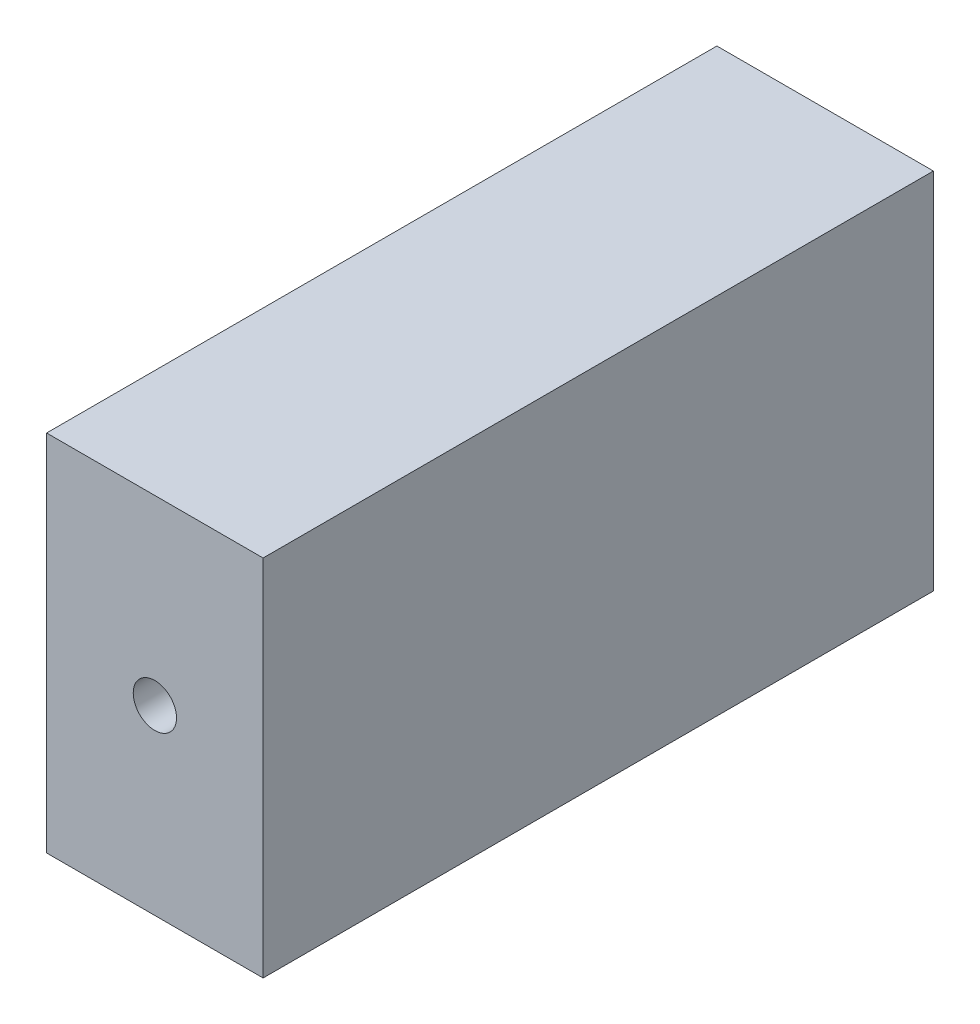
ISO-10303-21;
HEADER;
FILE_DESCRIPTION(('STEP AP214'),'2;1');
FILE_NAME('part.step','',(''),(''),'','','');
FILE_SCHEMA(('AUTOMOTIVE_DESIGN { 1 0 10303 214 1 1 1 1 }'));
ENDSEC;
DATA;
#1=APPLICATION_CONTEXT('core data for automotive mechanical design processes');
#2=APPLICATION_PROTOCOL_DEFINITION('international standard','automotive_design',2000,#1);
#3=PRODUCT_CONTEXT('',#1,'mechanical');
#4=PRODUCT('Part','Part','',(#3));
#5=PRODUCT_RELATED_PRODUCT_CATEGORY('part','',(#4));
#6=PRODUCT_DEFINITION_FORMATION('','',#4);
#7=PRODUCT_DEFINITION_CONTEXT('part definition',#1,'design');
#8=PRODUCT_DEFINITION('design','',#6,#7);
#9=PRODUCT_DEFINITION_SHAPE('','',#8);
#10=(LENGTH_UNIT() NAMED_UNIT(*) SI_UNIT(.MILLI.,.METRE.));
#11=(NAMED_UNIT(*) PLANE_ANGLE_UNIT() SI_UNIT($,.RADIAN.));
#12=(NAMED_UNIT(*) SI_UNIT($,.STERADIAN.) SOLID_ANGLE_UNIT());
#13=UNCERTAINTY_MEASURE_WITH_UNIT(LENGTH_MEASURE(1.E-05),#10,'distance_accuracy_value','');
#14=(GEOMETRIC_REPRESENTATION_CONTEXT(3) GLOBAL_UNCERTAINTY_ASSIGNED_CONTEXT((#13)) GLOBAL_UNIT_ASSIGNED_CONTEXT((#10,
#11,#12)) REPRESENTATION_CONTEXT('',''));
#15=CARTESIAN_POINT('',(0.,0.,0.));
#16=DIRECTION('',(0.,0.,1.));
#17=DIRECTION('',(1.,0.,0.));
#18=AXIS2_PLACEMENT_3D('',#15,#16,#17);
#19=CARTESIAN_POINT('',(25.4,42.674371654535,-78.6359208016151));
#20=DIRECTION('',(0.,0.,1.));
#21=DIRECTION('',(1.,0.,0.));
#22=AXIS2_PLACEMENT_3D('',#19,#20,#21);
#23=PLANE('',#22);
#24=CARTESIAN_POINT('',(0.,0.,-78.6359208016151));
#25=DIRECTION('',(0.,0.,1.));
#26=DIRECTION('',(1.,0.,0.));
#27=AXIS2_PLACEMENT_3D('',#24,#25,#26);
#28=CIRCLE('',#27,5.08);
#29=CARTESIAN_POINT('',(5.08,0.,-78.6359208016151));
#30=VERTEX_POINT('',#29);
#31=EDGE_CURVE('E46',#30,#30,#28,.F.);
#32=ORIENTED_EDGE('',*,*,#31,.F.);
#33=EDGE_LOOP('',(#32));
#34=FACE_BOUND('',#33,.T.);
#35=DIRECTION('',(0.,1.,0.));
#36=VECTOR('',#35,1.);
#37=CARTESIAN_POINT('',(-25.4,42.674371654535,-78.6359208016151));
#38=LINE('',#37,#36);
#39=CARTESIAN_POINT('',(-25.4,-42.674371654535,-78.6359208016151));
#40=VERTEX_POINT('',#39);
#41=CARTESIAN_POINT('',(-25.4,42.674371654535,-78.6359208016151));
#42=VERTEX_POINT('',#41);
#43=EDGE_CURVE('E109',#40,#42,#38,.T.);
#44=ORIENTED_EDGE('',*,*,#43,.T.);
#45=DIRECTION('',(-1.,0.,0.));
#46=VECTOR('',#45,1.);
#47=CARTESIAN_POINT('',(25.4,42.674371654535,-78.6359208016151));
#48=LINE('',#47,#46);
#49=CARTESIAN_POINT('',(25.4,42.674371654535,-78.6359208016151));
#50=VERTEX_POINT('',#49);
#51=EDGE_CURVE('E12',#50,#42,#48,.T.);
#52=ORIENTED_EDGE('',*,*,#51,.F.);
#53=DIRECTION('',(0.,1.,0.));
#54=VECTOR('',#53,1.);
#55=CARTESIAN_POINT('',(25.4,42.674371654535,-78.6359208016151));
#56=LINE('',#55,#54);
#57=CARTESIAN_POINT('',(25.4,-42.674371654535,-78.6359208016151));
#58=VERTEX_POINT('',#57);
#59=EDGE_CURVE('E96',#58,#50,#56,.T.);
#60=ORIENTED_EDGE('',*,*,#59,.F.);
#61=DIRECTION('',(-1.,0.,0.));
#62=VECTOR('',#61,1.);
#63=CARTESIAN_POINT('',(25.4,-42.674371654535,-78.6359208016151));
#64=LINE('',#63,#62);
#65=EDGE_CURVE('E105',#58,#40,#64,.T.);
#66=ORIENTED_EDGE('',*,*,#65,.T.);
#67=EDGE_LOOP('',(#44,#52,#60,#66));
#68=FACE_BOUND('',#67,.T.);
#69=ADVANCED_FACE('F43',(#34,#68),#23,.F.);
#70=CARTESIAN_POINT('',(25.4,42.674371654535,78.6359208016151));
#71=DIRECTION('',(0.,-1.,0.));
#72=DIRECTION('',(0.,0.,-1.));
#73=AXIS2_PLACEMENT_3D('',#70,#71,#72);
#74=PLANE('',#73);
#75=DIRECTION('',(0.,0.,1.));
#76=VECTOR('',#75,1.);
#77=CARTESIAN_POINT('',(-25.4,42.674371654535,78.6359208016151));
#78=LINE('',#77,#76);
#79=CARTESIAN_POINT('',(-25.4,42.674371654535,78.6359208016151));
#80=VERTEX_POINT('',#79);
#81=EDGE_CURVE('E100',#42,#80,#78,.T.);
#82=ORIENTED_EDGE('',*,*,#81,.T.);
#83=DIRECTION('',(-1.,0.,0.));
#84=VECTOR('',#83,1.);
#85=CARTESIAN_POINT('',(25.4,42.674371654535,78.6359208016151));
#86=LINE('',#85,#84);
#87=CARTESIAN_POINT('',(25.4,42.674371654535,78.6359208016151));
#88=VERTEX_POINT('',#87);
#89=EDGE_CURVE('E52',#88,#80,#86,.T.);
#90=ORIENTED_EDGE('',*,*,#89,.F.);
#91=DIRECTION('',(0.,0.,1.));
#92=VECTOR('',#91,1.);
#93=CARTESIAN_POINT('',(25.4,42.674371654535,78.6359208016151));
#94=LINE('',#93,#92);
#95=EDGE_CURVE('E91',#50,#88,#94,.T.);
#96=ORIENTED_EDGE('',*,*,#95,.F.);
#97=ORIENTED_EDGE('',*,*,#51,.T.);
#98=EDGE_LOOP('',(#82,#90,#96,#97));
#99=FACE_BOUND('',#98,.T.);
#100=ADVANCED_FACE('F99',(#99),#74,.F.);
#101=CARTESIAN_POINT('',(25.4,42.674371654535,78.6359208016151));
#102=DIRECTION('',(0.,0.,-1.));
#103=DIRECTION('',(-1.,0.,0.));
#104=AXIS2_PLACEMENT_3D('',#101,#102,#103);
#105=PLANE('',#104);
#106=CARTESIAN_POINT('',(0.,0.,78.6359208016151));
#107=DIRECTION('',(0.,0.,-1.));
#108=DIRECTION('',(-1.,0.,0.));
#109=AXIS2_PLACEMENT_3D('',#106,#107,#108);
#110=CIRCLE('',#109,5.08);
#111=CARTESIAN_POINT('',(-5.08,0.,78.6359208016151));
#112=VERTEX_POINT('',#111);
#113=EDGE_CURVE('E116',#112,#112,#110,.F.);
#114=ORIENTED_EDGE('',*,*,#113,.F.);
#115=EDGE_LOOP('',(#114));
#116=FACE_BOUND('',#115,.T.);
#117=DIRECTION('',(0.,-1.,0.));
#118=VECTOR('',#117,1.);
#119=CARTESIAN_POINT('',(-25.4,42.674371654535,78.6359208016151));
#120=LINE('',#119,#118);
#121=CARTESIAN_POINT('',(-25.4,-42.674371654535,78.6359208016151));
#122=VERTEX_POINT('',#121);
#123=EDGE_CURVE('E78',#80,#122,#120,.T.);
#124=ORIENTED_EDGE('',*,*,#123,.T.);
#125=DIRECTION('',(-1.,0.,0.));
#126=VECTOR('',#125,1.);
#127=CARTESIAN_POINT('',(25.4,-42.674371654535,78.6359208016151));
#128=LINE('',#127,#126);
#129=CARTESIAN_POINT('',(25.4,-42.674371654535,78.6359208016151));
#130=VERTEX_POINT('',#129);
#131=EDGE_CURVE('E101',#130,#122,#128,.T.);
#132=ORIENTED_EDGE('',*,*,#131,.F.);
#133=DIRECTION('',(0.,-1.,0.));
#134=VECTOR('',#133,1.);
#135=CARTESIAN_POINT('',(25.4,42.674371654535,78.6359208016151));
#136=LINE('',#135,#134);
#137=EDGE_CURVE('E94',#88,#130,#136,.T.);
#138=ORIENTED_EDGE('',*,*,#137,.F.);
#139=ORIENTED_EDGE('',*,*,#89,.T.);
#140=EDGE_LOOP('',(#124,#132,#138,#139));
#141=FACE_BOUND('',#140,.T.);
#142=ADVANCED_FACE('F103',(#116,#141),#105,.F.);
#143=CARTESIAN_POINT('',(25.4,-42.674371654535,78.6359208016151));
#144=DIRECTION('',(0.,1.,0.));
#145=DIRECTION('',(0.,0.,1.));
#146=AXIS2_PLACEMENT_3D('',#143,#144,#145);
#147=PLANE('',#146);
#148=DIRECTION('',(0.,0.,-1.));
#149=VECTOR('',#148,1.);
#150=CARTESIAN_POINT('',(-25.4,-42.674371654535,78.6359208016151));
#151=LINE('',#150,#149);
#152=EDGE_CURVE('E84',#122,#40,#151,.T.);
#153=ORIENTED_EDGE('',*,*,#152,.T.);
#154=ORIENTED_EDGE('',*,*,#65,.F.);
#155=DIRECTION('',(0.,0.,-1.));
#156=VECTOR('',#155,1.);
#157=CARTESIAN_POINT('',(25.4,-42.674371654535,78.6359208016151));
#158=LINE('',#157,#156);
#159=EDGE_CURVE('E61',#130,#58,#158,.T.);
#160=ORIENTED_EDGE('',*,*,#159,.F.);
#161=ORIENTED_EDGE('',*,*,#131,.T.);
#162=EDGE_LOOP('',(#153,#154,#160,#161));
#163=FACE_BOUND('',#162,.T.);
#164=ADVANCED_FACE('F156',(#163),#147,.F.);
#165=CARTESIAN_POINT('',(25.4,0.,0.));
#166=DIRECTION('',(1.,0.,0.));
#167=DIRECTION('',(0.,0.,-1.));
#168=AXIS2_PLACEMENT_3D('',#165,#166,#167);
#169=PLANE('',#168);
#170=ORIENTED_EDGE('',*,*,#59,.T.);
#171=ORIENTED_EDGE('',*,*,#95,.T.);
#172=ORIENTED_EDGE('',*,*,#137,.T.);
#173=ORIENTED_EDGE('',*,*,#159,.T.);
#174=EDGE_LOOP('',(#170,#171,#172,#173));
#175=FACE_BOUND('',#174,.T.);
#176=ADVANCED_FACE('F92',(#175),#169,.T.);
#177=CARTESIAN_POINT('',(-25.4,0.,0.));
#178=DIRECTION('',(1.,0.,0.));
#179=DIRECTION('',(0.,0.,-1.));
#180=AXIS2_PLACEMENT_3D('',#177,#178,#179);
#181=PLANE('',#180);
#182=ORIENTED_EDGE('',*,*,#43,.F.);
#183=ORIENTED_EDGE('',*,*,#152,.F.);
#184=ORIENTED_EDGE('',*,*,#123,.F.);
#185=ORIENTED_EDGE('',*,*,#81,.F.);
#186=EDGE_LOOP('',(#182,#183,#184,#185));
#187=FACE_BOUND('',#186,.T.);
#188=ADVANCED_FACE('F143',(#187),#181,.F.);
#189=CARTESIAN_POINT('',(0.,0.,-40.3122007325297));
#190=DIRECTION('',(0.,0.,-1.));
#191=DIRECTION('',(-1.,0.,0.));
#192=AXIS2_PLACEMENT_3D('',#189,#190,#191);
#193=CYLINDRICAL_SURFACE('',#192,5.08);
#194=CARTESIAN_POINT('',(0.,0.,-46.2429474483486));
#195=DIRECTION('',(0.,-0.462552923998327,-0.88659167179745));
#196=DIRECTION('',(0.,-0.88659167179745,0.462552923998327));
#197=AXIS2_PLACEMENT_3D('',#194,#195,#196);
#198=ELLIPSE('',#197,5.72980793931997,5.08);
#199=CARTESIAN_POINT('',(0.,-5.07999999999999,-43.5926080320673));
#200=VERTEX_POINT('',#199);
#201=EDGE_CURVE('E133',#200,#200,#198,.T.);
#202=ORIENTED_EDGE('',*,*,#201,.F.);
#203=EDGE_LOOP('',(#202));
#204=FACE_BOUND('',#203,.T.);
#205=ORIENTED_EDGE('',*,*,#31,.T.);
#206=EDGE_LOOP('',(#205));
#207=FACE_BOUND('',#206,.T.);
#208=ADVANCED_FACE('F139',(#204,#207),#193,.F.);
#209=CARTESIAN_POINT('',(0.,0.,86.8859445844237));
#210=DIRECTION('',(0.,0.,-1.));
#211=DIRECTION('',(-1.,0.,0.));
#212=AXIS2_PLACEMENT_3D('',#209,#210,#211);
#213=CYLINDRICAL_SURFACE('',#212,5.08);
#214=CARTESIAN_POINT('',(0.,0.,36.0138675869734));
#215=DIRECTION('',(0.,0.546184510297637,-0.837664897623704));
#216=DIRECTION('',(0.,-0.837664897623704,-0.546184510297637));
#217=AXIS2_PLACEMENT_3D('',#214,#215,#216);
#218=ELLIPSE('',#217,6.06447759051501,5.08);
#219=CARTESIAN_POINT('',(0.,-5.08,32.701543863987));
#220=VERTEX_POINT('',#219);
#221=EDGE_CURVE('E118',#220,#220,#218,.T.);
#222=ORIENTED_EDGE('',*,*,#221,.T.);
#223=EDGE_LOOP('',(#222));
#224=FACE_BOUND('',#223,.T.);
#225=ORIENTED_EDGE('',*,*,#113,.T.);
#226=EDGE_LOOP('',(#225));
#227=FACE_BOUND('',#226,.T.);
#228=ADVANCED_FACE('F142',(#224,#227),#213,.F.);
#229=CARTESIAN_POINT('',(0.,33.2372159452722,-23.0597354616095));
#230=DIRECTION('',(0.,-0.820191140364952,-0.572089585001195));
#231=DIRECTION('',(0.,0.572089585001195,-0.820191140364952));
#232=AXIS2_PLACEMENT_3D('',#229,#230,#231);
#233=CYLINDRICAL_SURFACE('',#232,5.08);
#234=CARTESIAN_POINT('',(0.,28.3728700332091,-26.4526538890095));
#235=DIRECTION('',(0.,-0.462552923998327,-0.88659167179745));
#236=DIRECTION('',(0.,0.88659167179745,-0.462552923998327));
#237=AXIS2_PLACEMENT_3D('',#234,#235,#236);
#238=ELLIPSE('',#237,5.72980793931998,5.08);
#239=CARTESIAN_POINT('',(0.,33.4528700332091,-29.1029933052908));
#240=VERTEX_POINT('',#239);
#241=EDGE_CURVE('E128',#240,#240,#238,.T.);
#242=ORIENTED_EDGE('',*,*,#241,.F.);
#243=EDGE_LOOP('',(#242));
#244=FACE_BOUND('',#243,.T.);
#245=ORIENTED_EDGE('',*,*,#201,.T.);
#246=EDGE_LOOP('',(#245));
#247=FACE_BOUND('',#246,.T.);
#248=ADVANCED_FACE('F137',(#244,#247),#233,.F.);
#249=CARTESIAN_POINT('',(0.,28.3728700332091,30.8937321875637));
#250=DIRECTION('',(0.,0.,-1.));
#251=DIRECTION('',(-1.,0.,0.));
#252=AXIS2_PLACEMENT_3D('',#249,#250,#251);
#253=CYLINDRICAL_SURFACE('',#252,5.08);
#254=CARTESIAN_POINT('',(0.,28.3728700332091,23.5066199969936));
#255=DIRECTION('',(0.,0.546184510297637,-0.837664897623704));
#256=DIRECTION('',(0.,0.837664897623704,0.546184510297637));
#257=AXIS2_PLACEMENT_3D('',#254,#255,#256);
#258=ELLIPSE('',#257,6.06447759051501,5.08);
#259=CARTESIAN_POINT('',(0.,33.4528700332091,26.81894371998));
#260=VERTEX_POINT('',#259);
#261=EDGE_CURVE('E123',#260,#260,#258,.T.);
#262=ORIENTED_EDGE('',*,*,#261,.F.);
#263=EDGE_LOOP('',(#262));
#264=FACE_BOUND('',#263,.T.);
#265=ORIENTED_EDGE('',*,*,#241,.T.);
#266=EDGE_LOOP('',(#265));
#267=FACE_BOUND('',#266,.T.);
#268=ADVANCED_FACE('F230',(#264,#267),#253,.F.);
#269=CARTESIAN_POINT('',(0.,-6.75949710952972,38.9935698107418));
#270=DIRECTION('',(0.,0.915039183804246,-0.40336496142186));
#271=DIRECTION('',(0.,0.40336496142186,0.915039183804246));
#272=AXIS2_PLACEMENT_3D('',#269,#270,#271);
#273=CYLINDRICAL_SURFACE('',#272,5.08);
#274=ORIENTED_EDGE('',*,*,#221,.F.);
#275=EDGE_LOOP('',(#274));
#276=FACE_BOUND('',#275,.T.);
#277=ORIENTED_EDGE('',*,*,#261,.T.);
#278=EDGE_LOOP('',(#277));
#279=FACE_BOUND('',#278,.T.);
#280=ADVANCED_FACE('F222',(#276,#279),#273,.F.);
#281=CLOSED_SHELL('',(#69,#100,#142,#164,#176,#188,#208,#228,#248,#268,#280));
#282=MANIFOLD_SOLID_BREP('B2',#281);
#283=ADVANCED_BREP_SHAPE_REPRESENTATION('',(#18,#282),#14);
#284=SHAPE_DEFINITION_REPRESENTATION(#9,#283);
ENDSEC;
END-ISO-10303-21;
